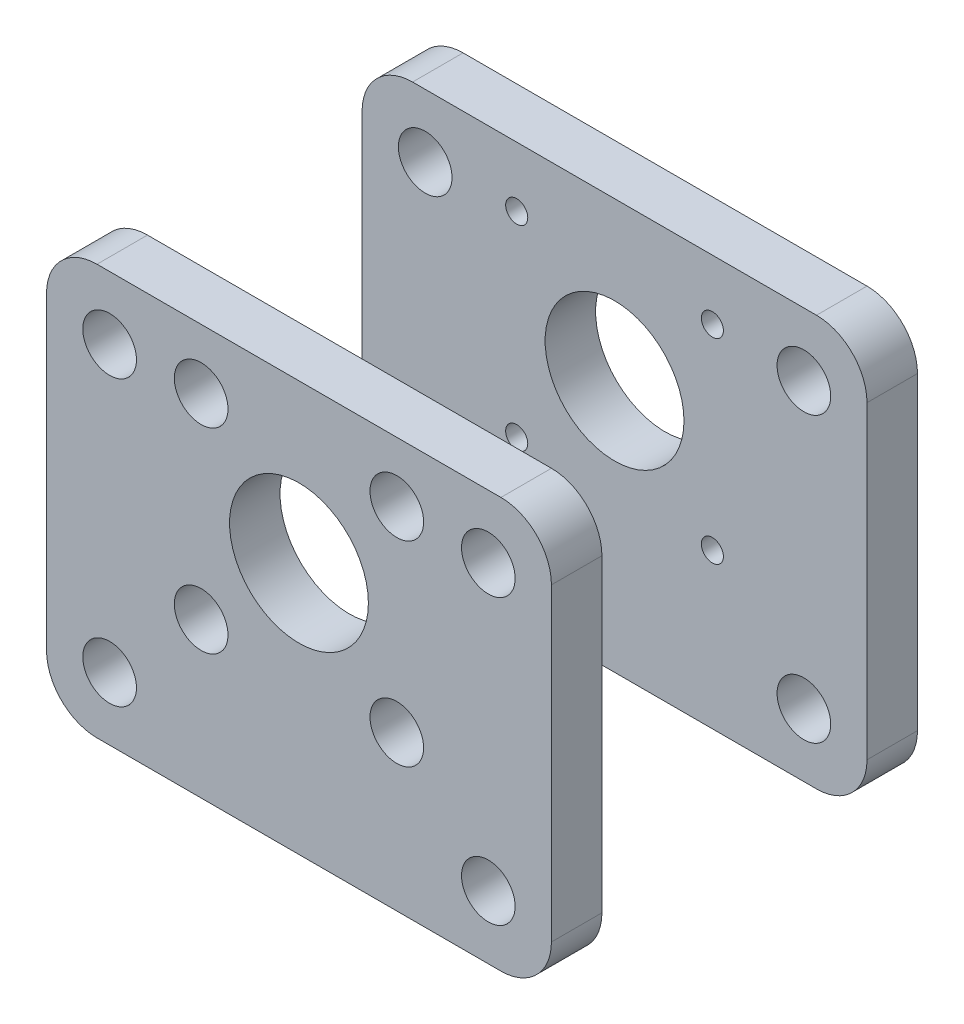
ISO-10303-21;
HEADER;
FILE_DESCRIPTION(('STEP AP214'),'2;1');
FILE_NAME('part.step','',(''),(''),'','','');
FILE_SCHEMA(('AUTOMOTIVE_DESIGN { 1 0 10303 214 1 1 1 1 }'));
ENDSEC;
DATA;
#1=APPLICATION_CONTEXT('core data for automotive mechanical design processes');
#2=APPLICATION_PROTOCOL_DEFINITION('international standard','automotive_design',2000,#1);
#3=PRODUCT_CONTEXT('',#1,'mechanical');
#4=PRODUCT('Part','Part','',(#3));
#5=PRODUCT_RELATED_PRODUCT_CATEGORY('part','',(#4));
#6=PRODUCT_DEFINITION_FORMATION('','',#4);
#7=PRODUCT_DEFINITION_CONTEXT('part definition',#1,'design');
#8=PRODUCT_DEFINITION('design','',#6,#7);
#9=PRODUCT_DEFINITION_SHAPE('','',#8);
#10=(LENGTH_UNIT() NAMED_UNIT(*) SI_UNIT(.MILLI.,.METRE.));
#11=(NAMED_UNIT(*) PLANE_ANGLE_UNIT() SI_UNIT($,.RADIAN.));
#12=(NAMED_UNIT(*) SI_UNIT($,.STERADIAN.) SOLID_ANGLE_UNIT());
#13=UNCERTAINTY_MEASURE_WITH_UNIT(LENGTH_MEASURE(1.E-05),#10,'distance_accuracy_value','');
#14=(GEOMETRIC_REPRESENTATION_CONTEXT(3) GLOBAL_UNCERTAINTY_ASSIGNED_CONTEXT((#13)) GLOBAL_UNIT_ASSIGNED_CONTEXT((#10,
#11,#12)) REPRESENTATION_CONTEXT('',''));
#15=CARTESIAN_POINT('',(0.,0.,0.));
#16=DIRECTION('',(0.,0.,1.));
#17=DIRECTION('',(1.,0.,0.));
#18=AXIS2_PLACEMENT_3D('',#15,#16,#17);
#19=CARTESIAN_POINT('',(-40.,25.,46.));
#20=DIRECTION('',(-1.,0.,0.));
#21=DIRECTION('',(0.,-1.,0.));
#22=AXIS2_PLACEMENT_3D('',#19,#20,#21);
#23=PLANE('',#22);
#24=DIRECTION('',(0.,-1.,0.));
#25=VECTOR('',#24,1.);
#26=CARTESIAN_POINT('',(-40.,25.,46.));
#27=LINE('',#26,#25);
#28=CARTESIAN_POINT('',(-40.,17.,46.));
#29=VERTEX_POINT('',#28);
#30=CARTESIAN_POINT('',(-40.,-32.,46.));
#31=VERTEX_POINT('',#30);
#32=EDGE_CURVE('E163',#29,#31,#27,.T.);
#33=ORIENTED_EDGE('',*,*,#32,.T.);
#34=DIRECTION('',(0.,0.,1.));
#35=VECTOR('',#34,1.);
#36=CARTESIAN_POINT('',(-40.,-32.,46.));
#37=LINE('',#36,#35);
#38=CARTESIAN_POINT('',(-40.,-32.,54.));
#39=VERTEX_POINT('',#38);
#40=EDGE_CURVE('E159',#31,#39,#37,.T.);
#41=ORIENTED_EDGE('',*,*,#40,.T.);
#42=DIRECTION('',(0.,-1.,0.));
#43=VECTOR('',#42,1.);
#44=CARTESIAN_POINT('',(-40.,25.,54.));
#45=LINE('',#44,#43);
#46=CARTESIAN_POINT('',(-40.,17.,54.));
#47=VERTEX_POINT('',#46);
#48=EDGE_CURVE('E112',#47,#39,#45,.T.);
#49=ORIENTED_EDGE('',*,*,#48,.F.);
#50=DIRECTION('',(0.,0.,1.));
#51=VECTOR('',#50,1.);
#52=CARTESIAN_POINT('',(-40.,17.,46.));
#53=LINE('',#52,#51);
#54=EDGE_CURVE('E157',#47,#29,#53,.F.);
#55=ORIENTED_EDGE('',*,*,#54,.T.);
#56=EDGE_LOOP('',(#33,#41,#49,#55));
#57=FACE_BOUND('',#56,.T.);
#58=ADVANCED_FACE('F41',(#57),#23,.T.);
#59=CARTESIAN_POINT('',(-40.,25.,46.));
#60=DIRECTION('',(0.,1.,0.));
#61=DIRECTION('',(0.,0.,1.));
#62=AXIS2_PLACEMENT_3D('',#59,#60,#61);
#63=PLANE('',#62);
#64=DIRECTION('',(-1.,0.,0.));
#65=VECTOR('',#64,1.);
#66=CARTESIAN_POINT('',(-40.,25.,46.));
#67=LINE('',#66,#65);
#68=CARTESIAN_POINT('',(32.,25.,46.));
#69=VERTEX_POINT('',#68);
#70=CARTESIAN_POINT('',(-32.,25.,46.));
#71=VERTEX_POINT('',#70);
#72=EDGE_CURVE('E133',#69,#71,#67,.T.);
#73=ORIENTED_EDGE('',*,*,#72,.T.);
#74=DIRECTION('',(0.,0.,1.));
#75=VECTOR('',#74,1.);
#76=CARTESIAN_POINT('',(-32.,25.,46.));
#77=LINE('',#76,#75);
#78=CARTESIAN_POINT('',(-32.,25.,54.));
#79=VERTEX_POINT('',#78);
#80=EDGE_CURVE('E12',#71,#79,#77,.T.);
#81=ORIENTED_EDGE('',*,*,#80,.T.);
#82=DIRECTION('',(-1.,0.,0.));
#83=VECTOR('',#82,1.);
#84=CARTESIAN_POINT('',(-40.,25.,54.));
#85=LINE('',#84,#83);
#86=CARTESIAN_POINT('',(32.,25.,54.));
#87=VERTEX_POINT('',#86);
#88=EDGE_CURVE('E140',#87,#79,#85,.T.);
#89=ORIENTED_EDGE('',*,*,#88,.F.);
#90=DIRECTION('',(0.,0.,1.));
#91=VECTOR('',#90,1.);
#92=CARTESIAN_POINT('',(32.,25.,46.));
#93=LINE('',#92,#91);
#94=EDGE_CURVE('E49',#87,#69,#93,.F.);
#95=ORIENTED_EDGE('',*,*,#94,.T.);
#96=EDGE_LOOP('',(#73,#81,#89,#95));
#97=FACE_BOUND('',#96,.T.);
#98=ADVANCED_FACE('F195',(#97),#63,.T.);
#99=CARTESIAN_POINT('',(40.,25.,46.));
#100=DIRECTION('',(1.,0.,0.));
#101=DIRECTION('',(0.,1.,0.));
#102=AXIS2_PLACEMENT_3D('',#99,#100,#101);
#103=PLANE('',#102);
#104=DIRECTION('',(0.,1.,0.));
#105=VECTOR('',#104,1.);
#106=CARTESIAN_POINT('',(40.,25.,54.));
#107=LINE('',#106,#105);
#108=CARTESIAN_POINT('',(40.,-32.,54.));
#109=VERTEX_POINT('',#108);
#110=CARTESIAN_POINT('',(40.,17.,54.));
#111=VERTEX_POINT('',#110);
#112=EDGE_CURVE('E128',#109,#111,#107,.T.);
#113=ORIENTED_EDGE('',*,*,#112,.F.);
#114=DIRECTION('',(0.,0.,1.));
#115=VECTOR('',#114,1.);
#116=CARTESIAN_POINT('',(40.,-32.,46.));
#117=LINE('',#116,#115);
#118=CARTESIAN_POINT('',(40.,-32.,46.));
#119=VERTEX_POINT('',#118);
#120=EDGE_CURVE('E149',#109,#119,#117,.F.);
#121=ORIENTED_EDGE('',*,*,#120,.T.);
#122=DIRECTION('',(0.,1.,0.));
#123=VECTOR('',#122,1.);
#124=CARTESIAN_POINT('',(40.,25.,46.));
#125=LINE('',#124,#123);
#126=CARTESIAN_POINT('',(40.,17.,46.));
#127=VERTEX_POINT('',#126);
#128=EDGE_CURVE('E137',#119,#127,#125,.T.);
#129=ORIENTED_EDGE('',*,*,#128,.T.);
#130=DIRECTION('',(0.,0.,1.));
#131=VECTOR('',#130,1.);
#132=CARTESIAN_POINT('',(40.,17.,46.));
#133=LINE('',#132,#131);
#134=EDGE_CURVE('E146',#127,#111,#133,.T.);
#135=ORIENTED_EDGE('',*,*,#134,.T.);
#136=EDGE_LOOP('',(#113,#121,#129,#135));
#137=FACE_BOUND('',#136,.T.);
#138=ADVANCED_FACE('F179',(#137),#103,.T.);
#139=CARTESIAN_POINT('',(-40.,-40.,46.));
#140=DIRECTION('',(0.,-1.,0.));
#141=DIRECTION('',(1.,0.,0.));
#142=AXIS2_PLACEMENT_3D('',#139,#140,#141);
#143=PLANE('',#142);
#144=DIRECTION('',(1.,0.,0.));
#145=VECTOR('',#144,1.);
#146=CARTESIAN_POINT('',(-40.,-40.,46.));
#147=LINE('',#146,#145);
#148=CARTESIAN_POINT('',(-32.,-40.,46.));
#149=VERTEX_POINT('',#148);
#150=CARTESIAN_POINT('',(32.,-40.,46.));
#151=VERTEX_POINT('',#150);
#152=EDGE_CURVE('E164',#149,#151,#147,.T.);
#153=ORIENTED_EDGE('',*,*,#152,.T.);
#154=DIRECTION('',(0.,0.,1.));
#155=VECTOR('',#154,1.);
#156=CARTESIAN_POINT('',(32.,-40.,46.));
#157=LINE('',#156,#155);
#158=CARTESIAN_POINT('',(32.,-40.,54.));
#159=VERTEX_POINT('',#158);
#160=EDGE_CURVE('E127',#151,#159,#157,.T.);
#161=ORIENTED_EDGE('',*,*,#160,.T.);
#162=DIRECTION('',(1.,0.,0.));
#163=VECTOR('',#162,1.);
#164=CARTESIAN_POINT('',(-40.,-40.,54.));
#165=LINE('',#164,#163);
#166=CARTESIAN_POINT('',(-32.,-40.,54.));
#167=VERTEX_POINT('',#166);
#168=EDGE_CURVE('E110',#167,#159,#165,.T.);
#169=ORIENTED_EDGE('',*,*,#168,.F.);
#170=DIRECTION('',(0.,0.,1.));
#171=VECTOR('',#170,1.);
#172=CARTESIAN_POINT('',(-32.,-40.,46.));
#173=LINE('',#172,#171);
#174=EDGE_CURVE('E124',#167,#149,#173,.F.);
#175=ORIENTED_EDGE('',*,*,#174,.T.);
#176=EDGE_LOOP('',(#153,#161,#169,#175));
#177=FACE_BOUND('',#176,.T.);
#178=ADVANCED_FACE('F123',(#177),#143,.T.);
#179=CARTESIAN_POINT('',(-40.,-40.,46.));
#180=DIRECTION('',(0.,0.,1.));
#181=DIRECTION('',(1.,0.,0.));
#182=AXIS2_PLACEMENT_3D('',#179,#180,#181);
#183=PLANE('',#182);
#184=CARTESIAN_POINT('',(15.5,15.5,46.));
#185=DIRECTION('',(0.,0.,1.));
#186=DIRECTION('',(1.,0.,0.));
#187=AXIS2_PLACEMENT_3D('',#184,#185,#186);
#188=CIRCLE('',#187,4.25);
#189=CARTESIAN_POINT('',(19.75,15.5,46.));
#190=VERTEX_POINT('',#189);
#191=EDGE_CURVE('E364',#190,#190,#188,.T.);
#192=ORIENTED_EDGE('',*,*,#191,.T.);
#193=EDGE_LOOP('',(#192));
#194=FACE_BOUND('',#193,.T.);
#195=CARTESIAN_POINT('',(15.5,-15.5,46.));
#196=DIRECTION('',(0.,0.,1.));
#197=DIRECTION('',(1.,0.,0.));
#198=AXIS2_PLACEMENT_3D('',#195,#196,#197);
#199=CIRCLE('',#198,4.25);
#200=CARTESIAN_POINT('',(19.75,-15.5,46.));
#201=VERTEX_POINT('',#200);
#202=EDGE_CURVE('E368',#201,#201,#199,.T.);
#203=ORIENTED_EDGE('',*,*,#202,.T.);
#204=EDGE_LOOP('',(#203));
#205=FACE_BOUND('',#204,.T.);
#206=CARTESIAN_POINT('',(-15.5,-15.5,46.));
#207=DIRECTION('',(0.,0.,1.));
#208=DIRECTION('',(1.,0.,0.));
#209=AXIS2_PLACEMENT_3D('',#206,#207,#208);
#210=CIRCLE('',#209,4.25);
#211=CARTESIAN_POINT('',(-11.25,-15.5,46.));
#212=VERTEX_POINT('',#211);
#213=EDGE_CURVE('E372',#212,#212,#210,.T.);
#214=ORIENTED_EDGE('',*,*,#213,.T.);
#215=EDGE_LOOP('',(#214));
#216=FACE_BOUND('',#215,.T.);
#217=CARTESIAN_POINT('',(-15.5,15.5,46.));
#218=DIRECTION('',(0.,0.,1.));
#219=DIRECTION('',(1.,0.,0.));
#220=AXIS2_PLACEMENT_3D('',#217,#218,#219);
#221=CIRCLE('',#220,4.25);
#222=CARTESIAN_POINT('',(-11.25,15.5,46.));
#223=VERTEX_POINT('',#222);
#224=EDGE_CURVE('E376',#223,#223,#221,.T.);
#225=ORIENTED_EDGE('',*,*,#224,.T.);
#226=EDGE_LOOP('',(#225));
#227=FACE_BOUND('',#226,.T.);
#228=CARTESIAN_POINT('',(30.,15.,46.));
#229=DIRECTION('',(0.,0.,1.));
#230=DIRECTION('',(1.,0.,0.));
#231=AXIS2_PLACEMENT_3D('',#228,#229,#230);
#232=CIRCLE('',#231,4.25000000000001);
#233=CARTESIAN_POINT('',(34.25,15.,46.));
#234=VERTEX_POINT('',#233);
#235=EDGE_CURVE('E380',#234,#234,#232,.T.);
#236=ORIENTED_EDGE('',*,*,#235,.T.);
#237=EDGE_LOOP('',(#236));
#238=FACE_BOUND('',#237,.T.);
#239=CARTESIAN_POINT('',(30.,-30.,46.));
#240=DIRECTION('',(0.,0.,1.));
#241=DIRECTION('',(1.,0.,0.));
#242=AXIS2_PLACEMENT_3D('',#239,#240,#241);
#243=CIRCLE('',#242,4.25);
#244=CARTESIAN_POINT('',(34.25,-30.,46.));
#245=VERTEX_POINT('',#244);
#246=EDGE_CURVE('E384',#245,#245,#243,.T.);
#247=ORIENTED_EDGE('',*,*,#246,.T.);
#248=EDGE_LOOP('',(#247));
#249=FACE_BOUND('',#248,.T.);
#250=CARTESIAN_POINT('',(-30.,-30.,46.));
#251=DIRECTION('',(0.,0.,1.));
#252=DIRECTION('',(1.,0.,0.));
#253=AXIS2_PLACEMENT_3D('',#250,#251,#252);
#254=CIRCLE('',#253,4.25);
#255=CARTESIAN_POINT('',(-25.75,-30.,46.));
#256=VERTEX_POINT('',#255);
#257=EDGE_CURVE('E388',#256,#256,#254,.T.);
#258=ORIENTED_EDGE('',*,*,#257,.T.);
#259=EDGE_LOOP('',(#258));
#260=FACE_BOUND('',#259,.T.);
#261=CARTESIAN_POINT('',(-30.,15.,46.));
#262=DIRECTION('',(0.,0.,1.));
#263=DIRECTION('',(1.,0.,0.));
#264=AXIS2_PLACEMENT_3D('',#261,#262,#263);
#265=CIRCLE('',#264,4.25000000000001);
#266=CARTESIAN_POINT('',(-25.75,15.,46.));
#267=VERTEX_POINT('',#266);
#268=EDGE_CURVE('E392',#267,#267,#265,.T.);
#269=ORIENTED_EDGE('',*,*,#268,.T.);
#270=EDGE_LOOP('',(#269));
#271=FACE_BOUND('',#270,.T.);
#272=CARTESIAN_POINT('',(0.,0.,46.));
#273=DIRECTION('',(0.,0.,1.));
#274=DIRECTION('',(1.,0.,0.));
#275=AXIS2_PLACEMENT_3D('',#272,#273,#274);
#276=CIRCLE('',#275,11.);
#277=CARTESIAN_POINT('',(11.,0.,46.));
#278=VERTEX_POINT('',#277);
#279=EDGE_CURVE('E174',#278,#278,#276,.T.);
#280=ORIENTED_EDGE('',*,*,#279,.T.);
#281=EDGE_LOOP('',(#280));
#282=FACE_BOUND('',#281,.T.);
#283=ORIENTED_EDGE('',*,*,#128,.F.);
#284=CARTESIAN_POINT('',(32.,-32.,46.));
#285=DIRECTION('',(0.,0.,1.));
#286=DIRECTION('',(1.,0.,0.));
#287=AXIS2_PLACEMENT_3D('',#284,#285,#286);
#288=CIRCLE('',#287,8.);
#289=EDGE_CURVE('E155',#119,#151,#288,.F.);
#290=ORIENTED_EDGE('',*,*,#289,.T.);
#291=ORIENTED_EDGE('',*,*,#152,.F.);
#292=CARTESIAN_POINT('',(-32.,-32.,46.));
#293=DIRECTION('',(0.,0.,1.));
#294=DIRECTION('',(1.,0.,0.));
#295=AXIS2_PLACEMENT_3D('',#292,#293,#294);
#296=CIRCLE('',#295,8.);
#297=EDGE_CURVE('E132',#149,#31,#296,.F.);
#298=ORIENTED_EDGE('',*,*,#297,.T.);
#299=ORIENTED_EDGE('',*,*,#32,.F.);
#300=CARTESIAN_POINT('',(-32.,17.,46.));
#301=DIRECTION('',(0.,0.,1.));
#302=DIRECTION('',(1.,0.,0.));
#303=AXIS2_PLACEMENT_3D('',#300,#301,#302);
#304=CIRCLE('',#303,8.);
#305=EDGE_CURVE('E56',#29,#71,#304,.F.);
#306=ORIENTED_EDGE('',*,*,#305,.T.);
#307=ORIENTED_EDGE('',*,*,#72,.F.);
#308=CARTESIAN_POINT('',(32.,17.,46.));
#309=DIRECTION('',(0.,0.,1.));
#310=DIRECTION('',(1.,0.,0.));
#311=AXIS2_PLACEMENT_3D('',#308,#309,#310);
#312=CIRCLE('',#311,8.);
#313=EDGE_CURVE('E151',#69,#127,#312,.F.);
#314=ORIENTED_EDGE('',*,*,#313,.T.);
#315=EDGE_LOOP('',(#283,#290,#291,#298,#299,#306,#307,#314));
#316=FACE_BOUND('',#315,.T.);
#317=ADVANCED_FACE('F185',(#194,#205,#216,#227,#238,#249,#260,#271,#282,#316),#183,.F.);
#318=CARTESIAN_POINT('',(-40.,-40.,54.));
#319=DIRECTION('',(0.,0.,1.));
#320=DIRECTION('',(1.,0.,0.));
#321=AXIS2_PLACEMENT_3D('',#318,#319,#320);
#322=PLANE('',#321);
#323=CARTESIAN_POINT('',(15.5,15.5,54.));
#324=DIRECTION('',(0.,0.,1.));
#325=DIRECTION('',(1.,0.,0.));
#326=AXIS2_PLACEMENT_3D('',#323,#324,#325);
#327=CIRCLE('',#326,4.25);
#328=CARTESIAN_POINT('',(19.75,15.5,54.));
#329=VERTEX_POINT('',#328);
#330=EDGE_CURVE('E425',#329,#329,#327,.T.);
#331=ORIENTED_EDGE('',*,*,#330,.F.);
#332=EDGE_LOOP('',(#331));
#333=FACE_BOUND('',#332,.T.);
#334=CARTESIAN_POINT('',(15.5,-15.5,54.));
#335=DIRECTION('',(0.,0.,1.));
#336=DIRECTION('',(1.,0.,0.));
#337=AXIS2_PLACEMENT_3D('',#334,#335,#336);
#338=CIRCLE('',#337,4.25);
#339=CARTESIAN_POINT('',(19.75,-15.5,54.));
#340=VERTEX_POINT('',#339);
#341=EDGE_CURVE('E421',#340,#340,#338,.T.);
#342=ORIENTED_EDGE('',*,*,#341,.F.);
#343=EDGE_LOOP('',(#342));
#344=FACE_BOUND('',#343,.T.);
#345=CARTESIAN_POINT('',(-15.5,-15.5,54.));
#346=DIRECTION('',(0.,0.,1.));
#347=DIRECTION('',(1.,0.,0.));
#348=AXIS2_PLACEMENT_3D('',#345,#346,#347);
#349=CIRCLE('',#348,4.25);
#350=CARTESIAN_POINT('',(-11.25,-15.5,54.));
#351=VERTEX_POINT('',#350);
#352=EDGE_CURVE('E417',#351,#351,#349,.T.);
#353=ORIENTED_EDGE('',*,*,#352,.F.);
#354=EDGE_LOOP('',(#353));
#355=FACE_BOUND('',#354,.T.);
#356=CARTESIAN_POINT('',(-15.5,15.5,54.));
#357=DIRECTION('',(0.,0.,1.));
#358=DIRECTION('',(1.,0.,0.));
#359=AXIS2_PLACEMENT_3D('',#356,#357,#358);
#360=CIRCLE('',#359,4.25);
#361=CARTESIAN_POINT('',(-11.25,15.5,54.));
#362=VERTEX_POINT('',#361);
#363=EDGE_CURVE('E413',#362,#362,#360,.T.);
#364=ORIENTED_EDGE('',*,*,#363,.F.);
#365=EDGE_LOOP('',(#364));
#366=FACE_BOUND('',#365,.T.);
#367=CARTESIAN_POINT('',(30.,15.,54.));
#368=DIRECTION('',(0.,0.,1.));
#369=DIRECTION('',(1.,0.,0.));
#370=AXIS2_PLACEMENT_3D('',#367,#368,#369);
#371=CIRCLE('',#370,4.25000000000001);
#372=CARTESIAN_POINT('',(34.25,15.,54.));
#373=VERTEX_POINT('',#372);
#374=EDGE_CURVE('E409',#373,#373,#371,.T.);
#375=ORIENTED_EDGE('',*,*,#374,.F.);
#376=EDGE_LOOP('',(#375));
#377=FACE_BOUND('',#376,.T.);
#378=CARTESIAN_POINT('',(30.,-30.,54.));
#379=DIRECTION('',(0.,0.,1.));
#380=DIRECTION('',(1.,0.,0.));
#381=AXIS2_PLACEMENT_3D('',#378,#379,#380);
#382=CIRCLE('',#381,4.25);
#383=CARTESIAN_POINT('',(34.25,-30.,54.));
#384=VERTEX_POINT('',#383);
#385=EDGE_CURVE('E405',#384,#384,#382,.T.);
#386=ORIENTED_EDGE('',*,*,#385,.F.);
#387=EDGE_LOOP('',(#386));
#388=FACE_BOUND('',#387,.T.);
#389=CARTESIAN_POINT('',(-30.,-30.,54.));
#390=DIRECTION('',(0.,0.,1.));
#391=DIRECTION('',(1.,0.,0.));
#392=AXIS2_PLACEMENT_3D('',#389,#390,#391);
#393=CIRCLE('',#392,4.25);
#394=CARTESIAN_POINT('',(-25.75,-30.,54.));
#395=VERTEX_POINT('',#394);
#396=EDGE_CURVE('E401',#395,#395,#393,.T.);
#397=ORIENTED_EDGE('',*,*,#396,.F.);
#398=EDGE_LOOP('',(#397));
#399=FACE_BOUND('',#398,.T.);
#400=CARTESIAN_POINT('',(-30.,15.,54.));
#401=DIRECTION('',(0.,0.,1.));
#402=DIRECTION('',(1.,0.,0.));
#403=AXIS2_PLACEMENT_3D('',#400,#401,#402);
#404=CIRCLE('',#403,4.25000000000001);
#405=CARTESIAN_POINT('',(-25.75,15.,54.));
#406=VERTEX_POINT('',#405);
#407=EDGE_CURVE('E397',#406,#406,#404,.T.);
#408=ORIENTED_EDGE('',*,*,#407,.F.);
#409=EDGE_LOOP('',(#408));
#410=FACE_BOUND('',#409,.T.);
#411=CARTESIAN_POINT('',(0.,0.,54.));
#412=DIRECTION('',(0.,0.,1.));
#413=DIRECTION('',(1.,0.,0.));
#414=AXIS2_PLACEMENT_3D('',#411,#412,#413);
#415=CIRCLE('',#414,11.);
#416=CARTESIAN_POINT('',(11.,0.,54.));
#417=VERTEX_POINT('',#416);
#418=EDGE_CURVE('E169',#417,#417,#415,.T.);
#419=ORIENTED_EDGE('',*,*,#418,.F.);
#420=EDGE_LOOP('',(#419));
#421=FACE_BOUND('',#420,.T.);
#422=ORIENTED_EDGE('',*,*,#168,.T.);
#423=CARTESIAN_POINT('',(32.,-32.,54.));
#424=DIRECTION('',(0.,0.,1.));
#425=DIRECTION('',(1.,0.,0.));
#426=AXIS2_PLACEMENT_3D('',#423,#424,#425);
#427=CIRCLE('',#426,8.);
#428=EDGE_CURVE('E117',#159,#109,#427,.T.);
#429=ORIENTED_EDGE('',*,*,#428,.T.);
#430=ORIENTED_EDGE('',*,*,#112,.T.);
#431=CARTESIAN_POINT('',(32.,17.,54.));
#432=DIRECTION('',(0.,0.,1.));
#433=DIRECTION('',(1.,0.,0.));
#434=AXIS2_PLACEMENT_3D('',#431,#432,#433);
#435=CIRCLE('',#434,8.);
#436=EDGE_CURVE('E135',#111,#87,#435,.T.);
#437=ORIENTED_EDGE('',*,*,#436,.T.);
#438=ORIENTED_EDGE('',*,*,#88,.T.);
#439=CARTESIAN_POINT('',(-32.,17.,54.));
#440=DIRECTION('',(0.,0.,1.));
#441=DIRECTION('',(1.,0.,0.));
#442=AXIS2_PLACEMENT_3D('',#439,#440,#441);
#443=CIRCLE('',#442,8.);
#444=EDGE_CURVE('E118',#79,#47,#443,.T.);
#445=ORIENTED_EDGE('',*,*,#444,.T.);
#446=ORIENTED_EDGE('',*,*,#48,.T.);
#447=CARTESIAN_POINT('',(-32.,-32.,54.));
#448=DIRECTION('',(0.,0.,1.));
#449=DIRECTION('',(1.,0.,0.));
#450=AXIS2_PLACEMENT_3D('',#447,#448,#449);
#451=CIRCLE('',#450,8.);
#452=EDGE_CURVE('E107',#39,#167,#451,.T.);
#453=ORIENTED_EDGE('',*,*,#452,.T.);
#454=EDGE_LOOP('',(#422,#429,#430,#437,#438,#445,#446,#453));
#455=FACE_BOUND('',#454,.T.);
#456=ADVANCED_FACE('F109',(#333,#344,#355,#366,#377,#388,#399,#410,#421,#455),#322,.T.);
#457=CARTESIAN_POINT('',(0.,0.,46.));
#458=DIRECTION('',(0.,0.,1.));
#459=DIRECTION('',(1.,0.,0.));
#460=AXIS2_PLACEMENT_3D('',#457,#458,#459);
#461=CYLINDRICAL_SURFACE('',#460,11.);
#462=ORIENTED_EDGE('',*,*,#279,.F.);
#463=EDGE_LOOP('',(#462));
#464=FACE_BOUND('',#463,.T.);
#465=ORIENTED_EDGE('',*,*,#418,.T.);
#466=EDGE_LOOP('',(#465));
#467=FACE_BOUND('',#466,.T.);
#468=ADVANCED_FACE('F300',(#464,#467),#461,.F.);
#469=CARTESIAN_POINT('',(-30.,15.,46.));
#470=DIRECTION('',(0.,0.,1.));
#471=DIRECTION('',(1.,0.,0.));
#472=AXIS2_PLACEMENT_3D('',#469,#470,#471);
#473=CYLINDRICAL_SURFACE('',#472,4.25000000000001);
#474=ORIENTED_EDGE('',*,*,#268,.F.);
#475=EDGE_LOOP('',(#474));
#476=FACE_BOUND('',#475,.T.);
#477=ORIENTED_EDGE('',*,*,#407,.T.);
#478=EDGE_LOOP('',(#477));
#479=FACE_BOUND('',#478,.T.);
#480=ADVANCED_FACE('F291',(#476,#479),#473,.F.);
#481=CARTESIAN_POINT('',(-30.,-30.,46.));
#482=DIRECTION('',(0.,0.,1.));
#483=DIRECTION('',(1.,0.,0.));
#484=AXIS2_PLACEMENT_3D('',#481,#482,#483);
#485=CYLINDRICAL_SURFACE('',#484,4.25);
#486=ORIENTED_EDGE('',*,*,#257,.F.);
#487=EDGE_LOOP('',(#486));
#488=FACE_BOUND('',#487,.T.);
#489=ORIENTED_EDGE('',*,*,#396,.T.);
#490=EDGE_LOOP('',(#489));
#491=FACE_BOUND('',#490,.T.);
#492=ADVANCED_FACE('F282',(#488,#491),#485,.F.);
#493=CARTESIAN_POINT('',(30.,-30.,46.));
#494=DIRECTION('',(0.,0.,1.));
#495=DIRECTION('',(1.,0.,0.));
#496=AXIS2_PLACEMENT_3D('',#493,#494,#495);
#497=CYLINDRICAL_SURFACE('',#496,4.25);
#498=ORIENTED_EDGE('',*,*,#246,.F.);
#499=EDGE_LOOP('',(#498));
#500=FACE_BOUND('',#499,.T.);
#501=ORIENTED_EDGE('',*,*,#385,.T.);
#502=EDGE_LOOP('',(#501));
#503=FACE_BOUND('',#502,.T.);
#504=ADVANCED_FACE('F273',(#500,#503),#497,.F.);
#505=CARTESIAN_POINT('',(30.,15.,46.));
#506=DIRECTION('',(0.,0.,1.));
#507=DIRECTION('',(1.,0.,0.));
#508=AXIS2_PLACEMENT_3D('',#505,#506,#507);
#509=CYLINDRICAL_SURFACE('',#508,4.25000000000001);
#510=ORIENTED_EDGE('',*,*,#235,.F.);
#511=EDGE_LOOP('',(#510));
#512=FACE_BOUND('',#511,.T.);
#513=ORIENTED_EDGE('',*,*,#374,.T.);
#514=EDGE_LOOP('',(#513));
#515=FACE_BOUND('',#514,.T.);
#516=ADVANCED_FACE('F264',(#512,#515),#509,.F.);
#517=CARTESIAN_POINT('',(-15.5,15.5,46.));
#518=DIRECTION('',(0.,0.,1.));
#519=DIRECTION('',(1.,0.,0.));
#520=AXIS2_PLACEMENT_3D('',#517,#518,#519);
#521=CYLINDRICAL_SURFACE('',#520,4.25);
#522=ORIENTED_EDGE('',*,*,#224,.F.);
#523=EDGE_LOOP('',(#522));
#524=FACE_BOUND('',#523,.T.);
#525=ORIENTED_EDGE('',*,*,#363,.T.);
#526=EDGE_LOOP('',(#525));
#527=FACE_BOUND('',#526,.T.);
#528=ADVANCED_FACE('F255',(#524,#527),#521,.F.);
#529=CARTESIAN_POINT('',(-15.5,-15.5,46.));
#530=DIRECTION('',(0.,0.,1.));
#531=DIRECTION('',(1.,0.,0.));
#532=AXIS2_PLACEMENT_3D('',#529,#530,#531);
#533=CYLINDRICAL_SURFACE('',#532,4.25);
#534=ORIENTED_EDGE('',*,*,#213,.F.);
#535=EDGE_LOOP('',(#534));
#536=FACE_BOUND('',#535,.T.);
#537=ORIENTED_EDGE('',*,*,#352,.T.);
#538=EDGE_LOOP('',(#537));
#539=FACE_BOUND('',#538,.T.);
#540=ADVANCED_FACE('F246',(#536,#539),#533,.F.);
#541=CARTESIAN_POINT('',(15.5,-15.5,46.));
#542=DIRECTION('',(0.,0.,1.));
#543=DIRECTION('',(1.,0.,0.));
#544=AXIS2_PLACEMENT_3D('',#541,#542,#543);
#545=CYLINDRICAL_SURFACE('',#544,4.25);
#546=ORIENTED_EDGE('',*,*,#202,.F.);
#547=EDGE_LOOP('',(#546));
#548=FACE_BOUND('',#547,.T.);
#549=ORIENTED_EDGE('',*,*,#341,.T.);
#550=EDGE_LOOP('',(#549));
#551=FACE_BOUND('',#550,.T.);
#552=ADVANCED_FACE('F237',(#548,#551),#545,.F.);
#553=CARTESIAN_POINT('',(15.5,15.5,46.));
#554=DIRECTION('',(0.,0.,1.));
#555=DIRECTION('',(1.,0.,0.));
#556=AXIS2_PLACEMENT_3D('',#553,#554,#555);
#557=CYLINDRICAL_SURFACE('',#556,4.25);
#558=ORIENTED_EDGE('',*,*,#191,.F.);
#559=EDGE_LOOP('',(#558));
#560=FACE_BOUND('',#559,.T.);
#561=ORIENTED_EDGE('',*,*,#330,.T.);
#562=EDGE_LOOP('',(#561));
#563=FACE_BOUND('',#562,.T.);
#564=ADVANCED_FACE('F206',(#560,#563),#557,.F.);
#565=CARTESIAN_POINT('',(32.,-32.,46.));
#566=DIRECTION('',(0.,0.,1.));
#567=DIRECTION('',(1.,0.,0.));
#568=AXIS2_PLACEMENT_3D('',#565,#566,#567);
#569=CYLINDRICAL_SURFACE('',#568,8.);
#570=ORIENTED_EDGE('',*,*,#289,.F.);
#571=ORIENTED_EDGE('',*,*,#120,.F.);
#572=ORIENTED_EDGE('',*,*,#428,.F.);
#573=ORIENTED_EDGE('',*,*,#160,.F.);
#574=EDGE_LOOP('',(#570,#571,#572,#573));
#575=FACE_BOUND('',#574,.T.);
#576=ADVANCED_FACE('F184',(#575),#569,.T.);
#577=CARTESIAN_POINT('',(-32.,-32.,46.));
#578=DIRECTION('',(0.,0.,1.));
#579=DIRECTION('',(1.,0.,0.));
#580=AXIS2_PLACEMENT_3D('',#577,#578,#579);
#581=CYLINDRICAL_SURFACE('',#580,8.);
#582=ORIENTED_EDGE('',*,*,#297,.F.);
#583=ORIENTED_EDGE('',*,*,#174,.F.);
#584=ORIENTED_EDGE('',*,*,#452,.F.);
#585=ORIENTED_EDGE('',*,*,#40,.F.);
#586=EDGE_LOOP('',(#582,#583,#584,#585));
#587=FACE_BOUND('',#586,.T.);
#588=ADVANCED_FACE('F131',(#587),#581,.T.);
#589=CARTESIAN_POINT('',(-32.,17.,46.));
#590=DIRECTION('',(0.,0.,1.));
#591=DIRECTION('',(1.,0.,0.));
#592=AXIS2_PLACEMENT_3D('',#589,#590,#591);
#593=CYLINDRICAL_SURFACE('',#592,8.);
#594=ORIENTED_EDGE('',*,*,#305,.F.);
#595=ORIENTED_EDGE('',*,*,#54,.F.);
#596=ORIENTED_EDGE('',*,*,#444,.F.);
#597=ORIENTED_EDGE('',*,*,#80,.F.);
#598=EDGE_LOOP('',(#594,#595,#596,#597));
#599=FACE_BOUND('',#598,.T.);
#600=ADVANCED_FACE('F189',(#599),#593,.T.);
#601=CARTESIAN_POINT('',(32.,17.,46.));
#602=DIRECTION('',(0.,0.,1.));
#603=DIRECTION('',(1.,0.,0.));
#604=AXIS2_PLACEMENT_3D('',#601,#602,#603);
#605=CYLINDRICAL_SURFACE('',#604,8.);
#606=ORIENTED_EDGE('',*,*,#313,.F.);
#607=ORIENTED_EDGE('',*,*,#94,.F.);
#608=ORIENTED_EDGE('',*,*,#436,.F.);
#609=ORIENTED_EDGE('',*,*,#134,.F.);
#610=EDGE_LOOP('',(#606,#607,#608,#609));
#611=FACE_BOUND('',#610,.T.);
#612=ADVANCED_FACE('F43',(#611),#605,.T.);
#613=CLOSED_SHELL('',(#58,#98,#138,#178,#317,#456,#468,#480,#492,#504,#516,#528,#540,#552,#564,
#576,#588,#600,#612));
#614=MANIFOLD_SOLID_BREP('B2',#613);
#615=CARTESIAN_POINT('',(-40.,-40.,4.));
#616=DIRECTION('',(0.,0.,1.));
#617=DIRECTION('',(1.,0.,0.));
#618=AXIS2_PLACEMENT_3D('',#615,#616,#617);
#619=PLANE('',#618);
#620=CARTESIAN_POINT('',(-30.,-30.,4.));
#621=DIRECTION('',(0.,0.,1.));
#622=DIRECTION('',(1.,0.,0.));
#623=AXIS2_PLACEMENT_3D('',#620,#621,#622);
#624=CIRCLE('',#623,4.25);
#625=CARTESIAN_POINT('',(-25.75,-30.,4.));
#626=VERTEX_POINT('',#625);
#627=EDGE_CURVE('E643',#626,#626,#624,.T.);
#628=ORIENTED_EDGE('',*,*,#627,.F.);
#629=EDGE_LOOP('',(#628));
#630=FACE_BOUND('',#629,.T.);
#631=CARTESIAN_POINT('',(-30.,15.,4.));
#632=DIRECTION('',(0.,0.,1.));
#633=DIRECTION('',(1.,0.,0.));
#634=AXIS2_PLACEMENT_3D('',#631,#632,#633);
#635=CIRCLE('',#634,4.25000000000001);
#636=CARTESIAN_POINT('',(-25.75,15.,4.));
#637=VERTEX_POINT('',#636);
#638=EDGE_CURVE('E631',#637,#637,#635,.T.);
#639=ORIENTED_EDGE('',*,*,#638,.F.);
#640=EDGE_LOOP('',(#639));
#641=FACE_BOUND('',#640,.T.);
#642=CARTESIAN_POINT('',(15.5,15.5,4.));
#643=DIRECTION('',(0.,0.,1.));
#644=DIRECTION('',(1.,0.,0.));
#645=AXIS2_PLACEMENT_3D('',#642,#643,#644);
#646=CIRCLE('',#645,1.75);
#647=CARTESIAN_POINT('',(17.25,15.5,4.));
#648=VERTEX_POINT('',#647);
#649=EDGE_CURVE('E619',#648,#648,#646,.T.);
#650=ORIENTED_EDGE('',*,*,#649,.F.);
#651=EDGE_LOOP('',(#650));
#652=FACE_BOUND('',#651,.T.);
#653=CARTESIAN_POINT('',(-15.5,15.5,4.));
#654=DIRECTION('',(0.,0.,1.));
#655=DIRECTION('',(1.,0.,0.));
#656=AXIS2_PLACEMENT_3D('',#653,#654,#655);
#657=CIRCLE('',#656,1.75);
#658=CARTESIAN_POINT('',(-13.75,15.5,4.));
#659=VERTEX_POINT('',#658);
#660=EDGE_CURVE('E608',#659,#659,#657,.T.);
#661=ORIENTED_EDGE('',*,*,#660,.F.);
#662=EDGE_LOOP('',(#661));
#663=FACE_BOUND('',#662,.T.);
#664=DIRECTION('',(1.,0.,0.));
#665=VECTOR('',#664,1.);
#666=CARTESIAN_POINT('',(-40.,-40.,4.));
#667=LINE('',#666,#665);
#668=CARTESIAN_POINT('',(-32.,-40.,4.));
#669=VERTEX_POINT('',#668);
#670=CARTESIAN_POINT('',(32.,-40.,4.));
#671=VERTEX_POINT('',#670);
#672=EDGE_CURVE('E594',#669,#671,#667,.T.);
#673=ORIENTED_EDGE('',*,*,#672,.T.);
#674=CARTESIAN_POINT('',(32.,-32.,4.));
#675=DIRECTION('',(0.,0.,1.));
#676=DIRECTION('',(1.,0.,0.));
#677=AXIS2_PLACEMENT_3D('',#674,#675,#676);
#678=CIRCLE('',#677,8.);
#679=CARTESIAN_POINT('',(40.,-32.,4.));
#680=VERTEX_POINT('',#679);
#681=EDGE_CURVE('E572',#671,#680,#678,.T.);
#682=ORIENTED_EDGE('',*,*,#681,.T.);
#683=DIRECTION('',(0.,1.,0.));
#684=VECTOR('',#683,1.);
#685=CARTESIAN_POINT('',(40.,25.,4.));
#686=LINE('',#685,#684);
#687=CARTESIAN_POINT('',(40.,17.,4.));
#688=VERTEX_POINT('',#687);
#689=EDGE_CURVE('E542',#680,#688,#686,.T.);
#690=ORIENTED_EDGE('',*,*,#689,.T.);
#691=CARTESIAN_POINT('',(32.,17.,4.));
#692=DIRECTION('',(0.,0.,1.));
#693=DIRECTION('',(1.,0.,0.));
#694=AXIS2_PLACEMENT_3D('',#691,#692,#693);
#695=CIRCLE('',#694,8.);
#696=CARTESIAN_POINT('',(32.,25.,4.));
#697=VERTEX_POINT('',#696);
#698=EDGE_CURVE('E478',#688,#697,#695,.T.);
#699=ORIENTED_EDGE('',*,*,#698,.T.);
#700=DIRECTION('',(-1.,0.,0.));
#701=VECTOR('',#700,1.);
#702=CARTESIAN_POINT('',(-40.,25.,4.));
#703=LINE('',#702,#701);
#704=CARTESIAN_POINT('',(-32.,25.,4.));
#705=VERTEX_POINT('',#704);
#706=EDGE_CURVE('E558',#697,#705,#703,.T.);
#707=ORIENTED_EDGE('',*,*,#706,.T.);
#708=CARTESIAN_POINT('',(-32.,17.,4.));
#709=DIRECTION('',(0.,0.,1.));
#710=DIRECTION('',(1.,0.,0.));
#711=AXIS2_PLACEMENT_3D('',#708,#709,#710);
#712=CIRCLE('',#711,8.);
#713=CARTESIAN_POINT('',(-40.,17.,4.));
#714=VERTEX_POINT('',#713);
#715=EDGE_CURVE('E568',#705,#714,#712,.T.);
#716=ORIENTED_EDGE('',*,*,#715,.T.);
#717=DIRECTION('',(0.,-1.,0.));
#718=VECTOR('',#717,1.);
#719=CARTESIAN_POINT('',(-40.,25.,4.));
#720=LINE('',#719,#718);
#721=CARTESIAN_POINT('',(-40.,-32.,4.));
#722=VERTEX_POINT('',#721);
#723=EDGE_CURVE('E552',#714,#722,#720,.T.);
#724=ORIENTED_EDGE('',*,*,#723,.T.);
#725=CARTESIAN_POINT('',(-32.,-32.,4.));
#726=DIRECTION('',(0.,0.,1.));
#727=DIRECTION('',(1.,0.,0.));
#728=AXIS2_PLACEMENT_3D('',#725,#726,#727);
#729=CIRCLE('',#728,8.);
#730=EDGE_CURVE('E570',#722,#669,#729,.T.);
#731=ORIENTED_EDGE('',*,*,#730,.T.);
#732=EDGE_LOOP('',(#673,#682,#690,#699,#707,#716,#724,#731));
#733=FACE_BOUND('',#732,.T.);
#734=CARTESIAN_POINT('',(0.,0.,4.));
#735=DIRECTION('',(0.,0.,1.));
#736=DIRECTION('',(1.,0.,0.));
#737=AXIS2_PLACEMENT_3D('',#734,#735,#736);
#738=CIRCLE('',#737,11.);
#739=CARTESIAN_POINT('',(11.,0.,4.));
#740=VERTEX_POINT('',#739);
#741=EDGE_CURVE('E603',#740,#740,#738,.T.);
#742=ORIENTED_EDGE('',*,*,#741,.F.);
#743=EDGE_LOOP('',(#742));
#744=FACE_BOUND('',#743,.T.);
#745=CARTESIAN_POINT('',(-15.5,-15.5,4.));
#746=DIRECTION('',(0.,0.,1.));
#747=DIRECTION('',(1.,0.,0.));
#748=AXIS2_PLACEMENT_3D('',#745,#746,#747);
#749=CIRCLE('',#748,1.75);
#750=CARTESIAN_POINT('',(-13.75,-15.5,4.));
#751=VERTEX_POINT('',#750);
#752=EDGE_CURVE('E613',#751,#751,#749,.T.);
#753=ORIENTED_EDGE('',*,*,#752,.F.);
#754=EDGE_LOOP('',(#753));
#755=FACE_BOUND('',#754,.T.);
#756=CARTESIAN_POINT('',(15.5,-15.5,4.));
#757=DIRECTION('',(0.,0.,1.));
#758=DIRECTION('',(1.,0.,0.));
#759=AXIS2_PLACEMENT_3D('',#756,#757,#758);
#760=CIRCLE('',#759,1.75);
#761=CARTESIAN_POINT('',(17.25,-15.5,4.));
#762=VERTEX_POINT('',#761);
#763=EDGE_CURVE('E625',#762,#762,#760,.T.);
#764=ORIENTED_EDGE('',*,*,#763,.F.);
#765=EDGE_LOOP('',(#764));
#766=FACE_BOUND('',#765,.T.);
#767=CARTESIAN_POINT('',(30.,15.,4.));
#768=DIRECTION('',(0.,0.,1.));
#769=DIRECTION('',(1.,0.,0.));
#770=AXIS2_PLACEMENT_3D('',#767,#768,#769);
#771=CIRCLE('',#770,4.25000000000001);
#772=CARTESIAN_POINT('',(34.25,15.,4.));
#773=VERTEX_POINT('',#772);
#774=EDGE_CURVE('E637',#773,#773,#771,.T.);
#775=ORIENTED_EDGE('',*,*,#774,.F.);
#776=EDGE_LOOP('',(#775));
#777=FACE_BOUND('',#776,.T.);
#778=CARTESIAN_POINT('',(30.,-30.,4.));
#779=DIRECTION('',(0.,0.,1.));
#780=DIRECTION('',(1.,0.,0.));
#781=AXIS2_PLACEMENT_3D('',#778,#779,#780);
#782=CIRCLE('',#781,4.25);
#783=CARTESIAN_POINT('',(34.25,-30.,4.));
#784=VERTEX_POINT('',#783);
#785=EDGE_CURVE('E649',#784,#784,#782,.T.);
#786=ORIENTED_EDGE('',*,*,#785,.F.);
#787=EDGE_LOOP('',(#786));
#788=FACE_BOUND('',#787,.T.);
#789=ADVANCED_FACE('F458',(#630,#641,#652,#663,#733,#744,#755,#766,#777,#788),#619,.T.);
#790=CARTESIAN_POINT('',(-40.,-40.,-4.));
#791=DIRECTION('',(0.,0.,1.));
#792=DIRECTION('',(1.,0.,0.));
#793=AXIS2_PLACEMENT_3D('',#790,#791,#792);
#794=PLANE('',#793);
#795=CARTESIAN_POINT('',(-30.,-30.,-4.));
#796=DIRECTION('',(0.,0.,1.));
#797=DIRECTION('',(1.,0.,0.));
#798=AXIS2_PLACEMENT_3D('',#795,#796,#797);
#799=CIRCLE('',#798,4.25);
#800=CARTESIAN_POINT('',(-25.75,-30.,-4.));
#801=VERTEX_POINT('',#800);
#802=EDGE_CURVE('E646',#801,#801,#799,.T.);
#803=ORIENTED_EDGE('',*,*,#802,.T.);
#804=EDGE_LOOP('',(#803));
#805=FACE_BOUND('',#804,.T.);
#806=CARTESIAN_POINT('',(-30.,15.,-4.));
#807=DIRECTION('',(0.,0.,1.));
#808=DIRECTION('',(1.,0.,0.));
#809=AXIS2_PLACEMENT_3D('',#806,#807,#808);
#810=CIRCLE('',#809,4.25000000000001);
#811=CARTESIAN_POINT('',(-25.75,15.,-4.));
#812=VERTEX_POINT('',#811);
#813=EDGE_CURVE('E634',#812,#812,#810,.T.);
#814=ORIENTED_EDGE('',*,*,#813,.T.);
#815=EDGE_LOOP('',(#814));
#816=FACE_BOUND('',#815,.T.);
#817=CARTESIAN_POINT('',(15.5,15.5,-4.));
#818=DIRECTION('',(0.,0.,1.));
#819=DIRECTION('',(1.,0.,0.));
#820=AXIS2_PLACEMENT_3D('',#817,#818,#819);
#821=CIRCLE('',#820,1.75);
#822=CARTESIAN_POINT('',(17.25,15.5,-4.));
#823=VERTEX_POINT('',#822);
#824=EDGE_CURVE('E622',#823,#823,#821,.T.);
#825=ORIENTED_EDGE('',*,*,#824,.T.);
#826=EDGE_LOOP('',(#825));
#827=FACE_BOUND('',#826,.T.);
#828=CARTESIAN_POINT('',(-15.5,15.5,-4.));
#829=DIRECTION('',(0.,0.,1.));
#830=DIRECTION('',(1.,0.,0.));
#831=AXIS2_PLACEMENT_3D('',#828,#829,#830);
#832=CIRCLE('',#831,1.75);
#833=CARTESIAN_POINT('',(-13.75,15.5,-4.));
#834=VERTEX_POINT('',#833);
#835=EDGE_CURVE('E610',#834,#834,#832,.T.);
#836=ORIENTED_EDGE('',*,*,#835,.T.);
#837=EDGE_LOOP('',(#836));
#838=FACE_BOUND('',#837,.T.);
#839=DIRECTION('',(0.,1.,0.));
#840=VECTOR('',#839,1.);
#841=CARTESIAN_POINT('',(40.,25.,-4.));
#842=LINE('',#841,#840);
#843=CARTESIAN_POINT('',(40.,-32.,-4.));
#844=VERTEX_POINT('',#843);
#845=CARTESIAN_POINT('',(40.,17.,-4.));
#846=VERTEX_POINT('',#845);
#847=EDGE_CURVE('E540',#844,#846,#842,.T.);
#848=ORIENTED_EDGE('',*,*,#847,.F.);
#849=CARTESIAN_POINT('',(32.,-32.,-4.));
#850=DIRECTION('',(0.,0.,1.));
#851=DIRECTION('',(1.,0.,0.));
#852=AXIS2_PLACEMENT_3D('',#849,#850,#851);
#853=CIRCLE('',#852,8.);
#854=CARTESIAN_POINT('',(32.,-40.,-4.));
#855=VERTEX_POINT('',#854);
#856=EDGE_CURVE('E523',#844,#855,#853,.F.);
#857=ORIENTED_EDGE('',*,*,#856,.T.);
#858=DIRECTION('',(1.,0.,0.));
#859=VECTOR('',#858,1.);
#860=CARTESIAN_POINT('',(-40.,-40.,-4.));
#861=LINE('',#860,#859);
#862=CARTESIAN_POINT('',(-32.,-40.,-4.));
#863=VERTEX_POINT('',#862);
#864=EDGE_CURVE('E550',#863,#855,#861,.T.);
#865=ORIENTED_EDGE('',*,*,#864,.F.);
#866=CARTESIAN_POINT('',(-32.,-32.,-4.));
#867=DIRECTION('',(0.,0.,1.));
#868=DIRECTION('',(1.,0.,0.));
#869=AXIS2_PLACEMENT_3D('',#866,#867,#868);
#870=CIRCLE('',#869,8.);
#871=CARTESIAN_POINT('',(-40.,-32.,-4.));
#872=VERTEX_POINT('',#871);
#873=EDGE_CURVE('E534',#863,#872,#870,.F.);
#874=ORIENTED_EDGE('',*,*,#873,.T.);
#875=DIRECTION('',(0.,-1.,0.));
#876=VECTOR('',#875,1.);
#877=CARTESIAN_POINT('',(-40.,25.,-4.));
#878=LINE('',#877,#876);
#879=CARTESIAN_POINT('',(-40.,17.,-4.));
#880=VERTEX_POINT('',#879);
#881=EDGE_CURVE('E554',#880,#872,#878,.T.);
#882=ORIENTED_EDGE('',*,*,#881,.F.);
#883=CARTESIAN_POINT('',(-32.,17.,-4.));
#884=DIRECTION('',(0.,0.,1.));
#885=DIRECTION('',(1.,0.,0.));
#886=AXIS2_PLACEMENT_3D('',#883,#884,#885);
#887=CIRCLE('',#886,8.);
#888=CARTESIAN_POINT('',(-32.,25.,-4.));
#889=VERTEX_POINT('',#888);
#890=EDGE_CURVE('E561',#880,#889,#887,.F.);
#891=ORIENTED_EDGE('',*,*,#890,.T.);
#892=DIRECTION('',(-1.,0.,0.));
#893=VECTOR('',#892,1.);
#894=CARTESIAN_POINT('',(-40.,25.,-4.));
#895=LINE('',#894,#893);
#896=CARTESIAN_POINT('',(32.,25.,-4.));
#897=VERTEX_POINT('',#896);
#898=EDGE_CURVE('E549',#897,#889,#895,.T.);
#899=ORIENTED_EDGE('',*,*,#898,.F.);
#900=CARTESIAN_POINT('',(32.,17.,-4.));
#901=DIRECTION('',(0.,0.,1.));
#902=DIRECTION('',(1.,0.,0.));
#903=AXIS2_PLACEMENT_3D('',#900,#901,#902);
#904=CIRCLE('',#903,8.);
#905=EDGE_CURVE('E543',#897,#846,#904,.F.);
#906=ORIENTED_EDGE('',*,*,#905,.T.);
#907=EDGE_LOOP('',(#848,#857,#865,#874,#882,#891,#899,#906));
#908=FACE_BOUND('',#907,.T.);
#909=CARTESIAN_POINT('',(0.,0.,-4.));
#910=DIRECTION('',(0.,0.,1.));
#911=DIRECTION('',(1.,0.,0.));
#912=AXIS2_PLACEMENT_3D('',#909,#910,#911);
#913=CIRCLE('',#912,11.);
#914=CARTESIAN_POINT('',(11.,0.,-4.));
#915=VERTEX_POINT('',#914);
#916=EDGE_CURVE('E599',#915,#915,#913,.T.);
#917=ORIENTED_EDGE('',*,*,#916,.T.);
#918=EDGE_LOOP('',(#917));
#919=FACE_BOUND('',#918,.T.);
#920=CARTESIAN_POINT('',(-15.5,-15.5,-4.));
#921=DIRECTION('',(0.,0.,1.));
#922=DIRECTION('',(1.,0.,0.));
#923=AXIS2_PLACEMENT_3D('',#920,#921,#922);
#924=CIRCLE('',#923,1.75);
#925=CARTESIAN_POINT('',(-13.75,-15.5,-4.));
#926=VERTEX_POINT('',#925);
#927=EDGE_CURVE('E616',#926,#926,#924,.T.);
#928=ORIENTED_EDGE('',*,*,#927,.T.);
#929=EDGE_LOOP('',(#928));
#930=FACE_BOUND('',#929,.T.);
#931=CARTESIAN_POINT('',(15.5,-15.5,-4.));
#932=DIRECTION('',(0.,0.,1.));
#933=DIRECTION('',(1.,0.,0.));
#934=AXIS2_PLACEMENT_3D('',#931,#932,#933);
#935=CIRCLE('',#934,1.75);
#936=CARTESIAN_POINT('',(17.25,-15.5,-4.));
#937=VERTEX_POINT('',#936);
#938=EDGE_CURVE('E628',#937,#937,#935,.T.);
#939=ORIENTED_EDGE('',*,*,#938,.T.);
#940=EDGE_LOOP('',(#939));
#941=FACE_BOUND('',#940,.T.);
#942=CARTESIAN_POINT('',(30.,15.,-4.));
#943=DIRECTION('',(0.,0.,1.));
#944=DIRECTION('',(1.,0.,0.));
#945=AXIS2_PLACEMENT_3D('',#942,#943,#944);
#946=CIRCLE('',#945,4.25000000000001);
#947=CARTESIAN_POINT('',(34.25,15.,-4.));
#948=VERTEX_POINT('',#947);
#949=EDGE_CURVE('E640',#948,#948,#946,.T.);
#950=ORIENTED_EDGE('',*,*,#949,.T.);
#951=EDGE_LOOP('',(#950));
#952=FACE_BOUND('',#951,.T.);
#953=CARTESIAN_POINT('',(30.,-30.,-4.));
#954=DIRECTION('',(0.,0.,1.));
#955=DIRECTION('',(1.,0.,0.));
#956=AXIS2_PLACEMENT_3D('',#953,#954,#955);
#957=CIRCLE('',#956,4.25);
#958=CARTESIAN_POINT('',(34.25,-30.,-4.));
#959=VERTEX_POINT('',#958);
#960=EDGE_CURVE('E652',#959,#959,#957,.T.);
#961=ORIENTED_EDGE('',*,*,#960,.T.);
#962=EDGE_LOOP('',(#961));
#963=FACE_BOUND('',#962,.T.);
#964=ADVANCED_FACE('F546',(#805,#816,#827,#838,#908,#919,#930,#941,#952,#963),#794,.F.);
#965=CARTESIAN_POINT('',(-40.,25.,4.));
#966=DIRECTION('',(1.,0.,0.));
#967=DIRECTION('',(0.,0.,-1.));
#968=AXIS2_PLACEMENT_3D('',#965,#966,#967);
#969=PLANE('',#968);
#970=ORIENTED_EDGE('',*,*,#881,.T.);
#971=DIRECTION('',(0.,0.,-1.));
#972=VECTOR('',#971,1.);
#973=CARTESIAN_POINT('',(-40.,-32.,4.));
#974=LINE('',#973,#972);
#975=EDGE_CURVE('E577',#872,#722,#974,.F.);
#976=ORIENTED_EDGE('',*,*,#975,.T.);
#977=ORIENTED_EDGE('',*,*,#723,.F.);
#978=DIRECTION('',(0.,0.,-1.));
#979=VECTOR('',#978,1.);
#980=CARTESIAN_POINT('',(-40.,17.,4.));
#981=LINE('',#980,#979);
#982=EDGE_CURVE('E574',#714,#880,#981,.T.);
#983=ORIENTED_EDGE('',*,*,#982,.T.);
#984=EDGE_LOOP('',(#970,#976,#977,#983));
#985=FACE_BOUND('',#984,.T.);
#986=ADVANCED_FACE('F590',(#985),#969,.F.);
#987=CARTESIAN_POINT('',(-40.,-40.,4.));
#988=DIRECTION('',(0.,1.,0.));
#989=DIRECTION('',(0.,0.,1.));
#990=AXIS2_PLACEMENT_3D('',#987,#988,#989);
#991=PLANE('',#990);
#992=ORIENTED_EDGE('',*,*,#864,.T.);
#993=DIRECTION('',(0.,0.,-1.));
#994=VECTOR('',#993,1.);
#995=CARTESIAN_POINT('',(32.,-40.,4.));
#996=LINE('',#995,#994);
#997=EDGE_CURVE('E528',#855,#671,#996,.F.);
#998=ORIENTED_EDGE('',*,*,#997,.T.);
#999=ORIENTED_EDGE('',*,*,#672,.F.);
#1000=DIRECTION('',(0.,0.,-1.));
#1001=VECTOR('',#1000,1.);
#1002=CARTESIAN_POINT('',(-32.,-40.,4.));
#1003=LINE('',#1002,#1001);
#1004=EDGE_CURVE('E533',#669,#863,#1003,.T.);
#1005=ORIENTED_EDGE('',*,*,#1004,.T.);
#1006=EDGE_LOOP('',(#992,#998,#999,#1005));
#1007=FACE_BOUND('',#1006,.T.);
#1008=ADVANCED_FACE('F679',(#1007),#991,.F.);
#1009=CARTESIAN_POINT('',(40.,25.,4.));
#1010=DIRECTION('',(-1.,0.,0.));
#1011=DIRECTION('',(0.,0.,1.));
#1012=AXIS2_PLACEMENT_3D('',#1009,#1010,#1011);
#1013=PLANE('',#1012);
#1014=ORIENTED_EDGE('',*,*,#689,.F.);
#1015=DIRECTION('',(0.,0.,-1.));
#1016=VECTOR('',#1015,1.);
#1017=CARTESIAN_POINT('',(40.,-32.,4.));
#1018=LINE('',#1017,#1016);
#1019=EDGE_CURVE('E527',#680,#844,#1018,.T.);
#1020=ORIENTED_EDGE('',*,*,#1019,.T.);
#1021=ORIENTED_EDGE('',*,*,#847,.T.);
#1022=DIRECTION('',(0.,0.,-1.));
#1023=VECTOR('',#1022,1.);
#1024=CARTESIAN_POINT('',(40.,17.,4.));
#1025=LINE('',#1024,#1023);
#1026=EDGE_CURVE('E544',#846,#688,#1025,.F.);
#1027=ORIENTED_EDGE('',*,*,#1026,.T.);
#1028=EDGE_LOOP('',(#1014,#1020,#1021,#1027));
#1029=FACE_BOUND('',#1028,.T.);
#1030=ADVANCED_FACE('F539',(#1029),#1013,.F.);
#1031=CARTESIAN_POINT('',(-40.,25.,4.));
#1032=DIRECTION('',(0.,-1.,0.));
#1033=DIRECTION('',(0.,0.,-1.));
#1034=AXIS2_PLACEMENT_3D('',#1031,#1032,#1033);
#1035=PLANE('',#1034);
#1036=ORIENTED_EDGE('',*,*,#898,.T.);
#1037=DIRECTION('',(0.,0.,-1.));
#1038=VECTOR('',#1037,1.);
#1039=CARTESIAN_POINT('',(-32.,25.,4.));
#1040=LINE('',#1039,#1038);
#1041=EDGE_CURVE('E39',#889,#705,#1040,.F.);
#1042=ORIENTED_EDGE('',*,*,#1041,.T.);
#1043=ORIENTED_EDGE('',*,*,#706,.F.);
#1044=DIRECTION('',(0.,0.,-1.));
#1045=VECTOR('',#1044,1.);
#1046=CARTESIAN_POINT('',(32.,25.,4.));
#1047=LINE('',#1046,#1045);
#1048=EDGE_CURVE('E466',#697,#897,#1047,.T.);
#1049=ORIENTED_EDGE('',*,*,#1048,.T.);
#1050=EDGE_LOOP('',(#1036,#1042,#1043,#1049));
#1051=FACE_BOUND('',#1050,.T.);
#1052=ADVANCED_FACE('F580',(#1051),#1035,.F.);
#1053=CARTESIAN_POINT('',(0.,0.,4.));
#1054=DIRECTION('',(0.,0.,-1.));
#1055=DIRECTION('',(-1.,0.,0.));
#1056=AXIS2_PLACEMENT_3D('',#1053,#1054,#1055);
#1057=CYLINDRICAL_SURFACE('',#1056,11.);
#1058=ORIENTED_EDGE('',*,*,#741,.T.);
#1059=EDGE_LOOP('',(#1058));
#1060=FACE_BOUND('',#1059,.T.);
#1061=ORIENTED_EDGE('',*,*,#916,.F.);
#1062=EDGE_LOOP('',(#1061));
#1063=FACE_BOUND('',#1062,.T.);
#1064=ADVANCED_FACE('F672',(#1060,#1063),#1057,.F.);
#1065=CARTESIAN_POINT('',(-15.5,15.5,4.));
#1066=DIRECTION('',(0.,0.,-1.));
#1067=DIRECTION('',(-1.,0.,0.));
#1068=AXIS2_PLACEMENT_3D('',#1065,#1066,#1067);
#1069=CYLINDRICAL_SURFACE('',#1068,1.75);
#1070=ORIENTED_EDGE('',*,*,#660,.T.);
#1071=EDGE_LOOP('',(#1070));
#1072=FACE_BOUND('',#1071,.T.);
#1073=ORIENTED_EDGE('',*,*,#835,.F.);
#1074=EDGE_LOOP('',(#1073));
#1075=FACE_BOUND('',#1074,.T.);
#1076=ADVANCED_FACE('F737',(#1072,#1075),#1069,.F.);
#1077=CARTESIAN_POINT('',(-15.5,-15.5,4.));
#1078=DIRECTION('',(0.,0.,-1.));
#1079=DIRECTION('',(-1.,0.,0.));
#1080=AXIS2_PLACEMENT_3D('',#1077,#1078,#1079);
#1081=CYLINDRICAL_SURFACE('',#1080,1.75);
#1082=ORIENTED_EDGE('',*,*,#752,.T.);
#1083=EDGE_LOOP('',(#1082));
#1084=FACE_BOUND('',#1083,.T.);
#1085=ORIENTED_EDGE('',*,*,#927,.F.);
#1086=EDGE_LOOP('',(#1085));
#1087=FACE_BOUND('',#1086,.T.);
#1088=ADVANCED_FACE('F734',(#1084,#1087),#1081,.F.);
#1089=CARTESIAN_POINT('',(15.5,15.5,4.));
#1090=DIRECTION('',(0.,0.,-1.));
#1091=DIRECTION('',(-1.,0.,0.));
#1092=AXIS2_PLACEMENT_3D('',#1089,#1090,#1091);
#1093=CYLINDRICAL_SURFACE('',#1092,1.75);
#1094=ORIENTED_EDGE('',*,*,#649,.T.);
#1095=EDGE_LOOP('',(#1094));
#1096=FACE_BOUND('',#1095,.T.);
#1097=ORIENTED_EDGE('',*,*,#824,.F.);
#1098=EDGE_LOOP('',(#1097));
#1099=FACE_BOUND('',#1098,.T.);
#1100=ADVANCED_FACE('F730',(#1096,#1099),#1093,.F.);
#1101=CARTESIAN_POINT('',(15.5,-15.5,4.));
#1102=DIRECTION('',(0.,0.,-1.));
#1103=DIRECTION('',(-1.,0.,0.));
#1104=AXIS2_PLACEMENT_3D('',#1101,#1102,#1103);
#1105=CYLINDRICAL_SURFACE('',#1104,1.75);
#1106=ORIENTED_EDGE('',*,*,#763,.T.);
#1107=EDGE_LOOP('',(#1106));
#1108=FACE_BOUND('',#1107,.T.);
#1109=ORIENTED_EDGE('',*,*,#938,.F.);
#1110=EDGE_LOOP('',(#1109));
#1111=FACE_BOUND('',#1110,.T.);
#1112=ADVANCED_FACE('F726',(#1108,#1111),#1105,.F.);
#1113=CARTESIAN_POINT('',(-30.,15.,4.));
#1114=DIRECTION('',(0.,0.,-1.));
#1115=DIRECTION('',(-1.,0.,0.));
#1116=AXIS2_PLACEMENT_3D('',#1113,#1114,#1115);
#1117=CYLINDRICAL_SURFACE('',#1116,4.25000000000001);
#1118=ORIENTED_EDGE('',*,*,#638,.T.);
#1119=EDGE_LOOP('',(#1118));
#1120=FACE_BOUND('',#1119,.T.);
#1121=ORIENTED_EDGE('',*,*,#813,.F.);
#1122=EDGE_LOOP('',(#1121));
#1123=FACE_BOUND('',#1122,.T.);
#1124=ADVANCED_FACE('F710',(#1120,#1123),#1117,.F.);
#1125=CARTESIAN_POINT('',(30.,15.,4.));
#1126=DIRECTION('',(0.,0.,-1.));
#1127=DIRECTION('',(-1.,0.,0.));
#1128=AXIS2_PLACEMENT_3D('',#1125,#1126,#1127);
#1129=CYLINDRICAL_SURFACE('',#1128,4.25000000000001);
#1130=ORIENTED_EDGE('',*,*,#774,.T.);
#1131=EDGE_LOOP('',(#1130));
#1132=FACE_BOUND('',#1131,.T.);
#1133=ORIENTED_EDGE('',*,*,#949,.F.);
#1134=EDGE_LOOP('',(#1133));
#1135=FACE_BOUND('',#1134,.T.);
#1136=ADVANCED_FACE('F706',(#1132,#1135),#1129,.F.);
#1137=CARTESIAN_POINT('',(-30.,-30.,4.));
#1138=DIRECTION('',(0.,0.,-1.));
#1139=DIRECTION('',(-1.,0.,0.));
#1140=AXIS2_PLACEMENT_3D('',#1137,#1138,#1139);
#1141=CYLINDRICAL_SURFACE('',#1140,4.25);
#1142=ORIENTED_EDGE('',*,*,#627,.T.);
#1143=EDGE_LOOP('',(#1142));
#1144=FACE_BOUND('',#1143,.T.);
#1145=ORIENTED_EDGE('',*,*,#802,.F.);
#1146=EDGE_LOOP('',(#1145));
#1147=FACE_BOUND('',#1146,.T.);
#1148=ADVANCED_FACE('F709',(#1144,#1147),#1141,.F.);
#1149=CARTESIAN_POINT('',(30.,-30.,4.));
#1150=DIRECTION('',(0.,0.,-1.));
#1151=DIRECTION('',(-1.,0.,0.));
#1152=AXIS2_PLACEMENT_3D('',#1149,#1150,#1151);
#1153=CYLINDRICAL_SURFACE('',#1152,4.25);
#1154=ORIENTED_EDGE('',*,*,#785,.T.);
#1155=EDGE_LOOP('',(#1154));
#1156=FACE_BOUND('',#1155,.T.);
#1157=ORIENTED_EDGE('',*,*,#960,.F.);
#1158=EDGE_LOOP('',(#1157));
#1159=FACE_BOUND('',#1158,.T.);
#1160=ADVANCED_FACE('F658',(#1156,#1159),#1153,.F.);
#1161=CARTESIAN_POINT('',(32.,-32.,4.));
#1162=DIRECTION('',(0.,0.,-1.));
#1163=DIRECTION('',(-1.,0.,0.));
#1164=AXIS2_PLACEMENT_3D('',#1161,#1162,#1163);
#1165=CYLINDRICAL_SURFACE('',#1164,8.);
#1166=ORIENTED_EDGE('',*,*,#681,.F.);
#1167=ORIENTED_EDGE('',*,*,#997,.F.);
#1168=ORIENTED_EDGE('',*,*,#856,.F.);
#1169=ORIENTED_EDGE('',*,*,#1019,.F.);
#1170=EDGE_LOOP('',(#1166,#1167,#1168,#1169));
#1171=FACE_BOUND('',#1170,.T.);
#1172=ADVANCED_FACE('F526',(#1171),#1165,.T.);
#1173=CARTESIAN_POINT('',(-32.,-32.,4.));
#1174=DIRECTION('',(0.,0.,-1.));
#1175=DIRECTION('',(-1.,0.,0.));
#1176=AXIS2_PLACEMENT_3D('',#1173,#1174,#1175);
#1177=CYLINDRICAL_SURFACE('',#1176,8.);
#1178=ORIENTED_EDGE('',*,*,#730,.F.);
#1179=ORIENTED_EDGE('',*,*,#975,.F.);
#1180=ORIENTED_EDGE('',*,*,#873,.F.);
#1181=ORIENTED_EDGE('',*,*,#1004,.F.);
#1182=EDGE_LOOP('',(#1178,#1179,#1180,#1181));
#1183=FACE_BOUND('',#1182,.T.);
#1184=ADVANCED_FACE('F687',(#1183),#1177,.T.);
#1185=CARTESIAN_POINT('',(-32.,17.,4.));
#1186=DIRECTION('',(0.,0.,-1.));
#1187=DIRECTION('',(-1.,0.,0.));
#1188=AXIS2_PLACEMENT_3D('',#1185,#1186,#1187);
#1189=CYLINDRICAL_SURFACE('',#1188,8.);
#1190=ORIENTED_EDGE('',*,*,#715,.F.);
#1191=ORIENTED_EDGE('',*,*,#1041,.F.);
#1192=ORIENTED_EDGE('',*,*,#890,.F.);
#1193=ORIENTED_EDGE('',*,*,#982,.F.);
#1194=EDGE_LOOP('',(#1190,#1191,#1192,#1193));
#1195=FACE_BOUND('',#1194,.T.);
#1196=ADVANCED_FACE('F587',(#1195),#1189,.T.);
#1197=CARTESIAN_POINT('',(32.,17.,4.));
#1198=DIRECTION('',(0.,0.,-1.));
#1199=DIRECTION('',(-1.,0.,0.));
#1200=AXIS2_PLACEMENT_3D('',#1197,#1198,#1199);
#1201=CYLINDRICAL_SURFACE('',#1200,8.);
#1202=ORIENTED_EDGE('',*,*,#698,.F.);
#1203=ORIENTED_EDGE('',*,*,#1026,.F.);
#1204=ORIENTED_EDGE('',*,*,#905,.F.);
#1205=ORIENTED_EDGE('',*,*,#1048,.F.);
#1206=EDGE_LOOP('',(#1202,#1203,#1204,#1205));
#1207=FACE_BOUND('',#1206,.T.);
#1208=ADVANCED_FACE('F460',(#1207),#1201,.T.);
#1209=CLOSED_SHELL('',(#789,#964,#986,#1008,#1030,#1052,#1064,#1076,#1088,#1100,#1112,#1124,
#1136,#1148,#1160,#1172,#1184,#1196,#1208));
#1210=MANIFOLD_SOLID_BREP('B6',#1209);
#1211=ADVANCED_BREP_SHAPE_REPRESENTATION('',(#18,#614,#1210),#14);
#1212=SHAPE_DEFINITION_REPRESENTATION(#9,#1211);
ENDSEC;
END-ISO-10303-21;
